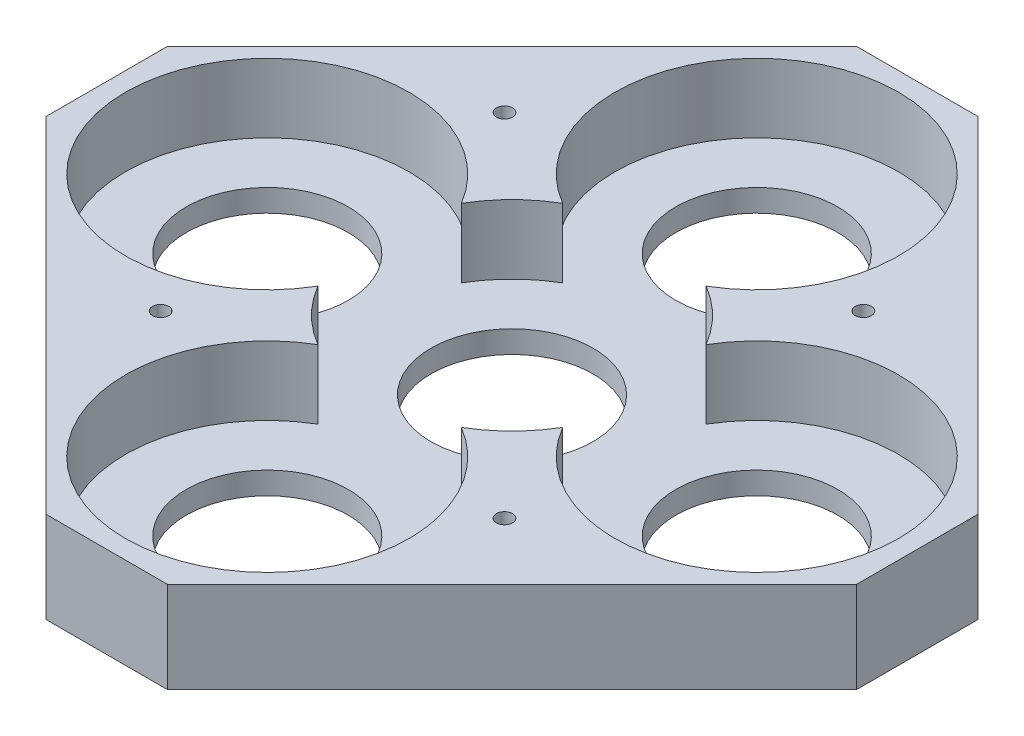
ISO-10303-21;
HEADER;
FILE_DESCRIPTION(('STEP AP214'),'2;1');
FILE_NAME('part.step','',(''),(''),'','','');
FILE_SCHEMA(('AUTOMOTIVE_DESIGN { 1 0 10303 214 1 1 1 1 }'));
ENDSEC;
DATA;
#1=APPLICATION_CONTEXT('core data for automotive mechanical design processes');
#2=APPLICATION_PROTOCOL_DEFINITION('international standard','automotive_design',2000,#1);
#3=PRODUCT_CONTEXT('',#1,'mechanical');
#4=PRODUCT('Part','Part','',(#3));
#5=PRODUCT_RELATED_PRODUCT_CATEGORY('part','',(#4));
#6=PRODUCT_DEFINITION_FORMATION('','',#4);
#7=PRODUCT_DEFINITION_CONTEXT('part definition',#1,'design');
#8=PRODUCT_DEFINITION('design','',#6,#7);
#9=PRODUCT_DEFINITION_SHAPE('','',#8);
#10=(LENGTH_UNIT() NAMED_UNIT(*) SI_UNIT(.MILLI.,.METRE.));
#11=(NAMED_UNIT(*) PLANE_ANGLE_UNIT() SI_UNIT($,.RADIAN.));
#12=(NAMED_UNIT(*) SI_UNIT($,.STERADIAN.) SOLID_ANGLE_UNIT());
#13=UNCERTAINTY_MEASURE_WITH_UNIT(LENGTH_MEASURE(1.E-05),#10,'distance_accuracy_value','');
#14=(GEOMETRIC_REPRESENTATION_CONTEXT(3) GLOBAL_UNCERTAINTY_ASSIGNED_CONTEXT((#13)) GLOBAL_UNIT_ASSIGNED_CONTEXT((#10,
#11,#12)) REPRESENTATION_CONTEXT('',''));
#15=CARTESIAN_POINT('',(0.,0.,0.));
#16=DIRECTION('',(0.,0.,1.));
#17=DIRECTION('',(1.,0.,0.));
#18=AXIS2_PLACEMENT_3D('',#15,#16,#17);
#19=CARTESIAN_POINT('',(273.05,0.,-127.));
#20=DIRECTION('',(0.707106781186548,0.,-0.707106781186548));
#21=DIRECTION('',(-0.707106781186548,0.,-0.707106781186547));
#22=AXIS2_PLACEMENT_3D('',#19,#20,#21);
#23=PLANE('',#22);
#24=DIRECTION('',(-0.707106781186548,0.,-0.707106781186547));
#25=VECTOR('',#24,1.);
#26=CARTESIAN_POINT('',(273.05,0.,-127.));
#27=LINE('',#26,#25);
#28=CARTESIAN_POINT('',(254.,0.,-146.05));
#29=VERTEX_POINT('',#28);
#30=CARTESIAN_POINT('',(146.05,0.,-254.));
#31=VERTEX_POINT('',#30);
#32=EDGE_CURVE('E228',#29,#31,#27,.T.);
#33=ORIENTED_EDGE('',*,*,#32,.T.);
#34=DIRECTION('',(0.,1.,0.));
#35=VECTOR('',#34,1.);
#36=CARTESIAN_POINT('',(146.05,0.,-254.));
#37=LINE('',#36,#35);
#38=CARTESIAN_POINT('',(146.05,28.575,-254.));
#39=VERTEX_POINT('',#38);
#40=EDGE_CURVE('E252',#31,#39,#37,.T.);
#41=ORIENTED_EDGE('',*,*,#40,.T.);
#42=DIRECTION('',(-0.707106781186548,0.,-0.707106781186547));
#43=VECTOR('',#42,1.);
#44=CARTESIAN_POINT('',(273.05,28.575,-127.));
#45=LINE('',#44,#43);
#46=CARTESIAN_POINT('',(254.,28.575,-146.05));
#47=VERTEX_POINT('',#46);
#48=EDGE_CURVE('E216',#47,#39,#45,.T.);
#49=ORIENTED_EDGE('',*,*,#48,.F.);
#50=DIRECTION('',(0.,-1.,0.));
#51=VECTOR('',#50,1.);
#52=CARTESIAN_POINT('',(254.,0.,-146.05));
#53=LINE('',#52,#51);
#54=EDGE_CURVE('E240',#47,#29,#53,.T.);
#55=ORIENTED_EDGE('',*,*,#54,.T.);
#56=EDGE_LOOP('',(#33,#41,#49,#55));
#57=FACE_BOUND('',#56,.T.);
#58=ADVANCED_FACE('F37',(#57),#23,.T.);
#59=CARTESIAN_POINT('',(127.,0.,19.05));
#60=DIRECTION('',(0.707106781186547,0.,0.707106781186547));
#61=DIRECTION('',(0.707106781186548,0.,-0.707106781186548));
#62=AXIS2_PLACEMENT_3D('',#59,#60,#61);
#63=PLANE('',#62);
#64=DIRECTION('',(0.707106781186548,0.,-0.707106781186548));
#65=VECTOR('',#64,1.);
#66=CARTESIAN_POINT('',(127.,0.,19.05));
#67=LINE('',#66,#65);
#68=CARTESIAN_POINT('',(146.05,0.,-1.76941794549634E-13));
#69=VERTEX_POINT('',#68);
#70=CARTESIAN_POINT('',(254.,0.,-107.95));
#71=VERTEX_POINT('',#70);
#72=EDGE_CURVE('E237',#69,#71,#67,.T.);
#73=ORIENTED_EDGE('',*,*,#72,.T.);
#74=DIRECTION('',(0.,1.,0.));
#75=VECTOR('',#74,1.);
#76=CARTESIAN_POINT('',(254.,0.,-107.95));
#77=LINE('',#76,#75);
#78=CARTESIAN_POINT('',(254.,28.575,-107.95));
#79=VERTEX_POINT('',#78);
#80=EDGE_CURVE('E277',#71,#79,#77,.T.);
#81=ORIENTED_EDGE('',*,*,#80,.T.);
#82=DIRECTION('',(0.707106781186548,0.,-0.707106781186548));
#83=VECTOR('',#82,1.);
#84=CARTESIAN_POINT('',(127.,28.575,19.05));
#85=LINE('',#84,#83);
#86=CARTESIAN_POINT('',(146.05,28.575,-1.76941794549634E-13));
#87=VERTEX_POINT('',#86);
#88=EDGE_CURVE('E232',#87,#79,#85,.T.);
#89=ORIENTED_EDGE('',*,*,#88,.F.);
#90=DIRECTION('',(0.,-1.,0.));
#91=VECTOR('',#90,1.);
#92=CARTESIAN_POINT('',(146.05,0.,-1.73472347597681E-13));
#93=LINE('',#92,#91);
#94=EDGE_CURVE('E275',#87,#69,#93,.T.);
#95=ORIENTED_EDGE('',*,*,#94,.T.);
#96=EDGE_LOOP('',(#73,#81,#89,#95));
#97=FACE_BOUND('',#96,.T.);
#98=ADVANCED_FACE('F309',(#97),#63,.T.);
#99=CARTESIAN_POINT('',(-19.05,0.,-127.));
#100=DIRECTION('',(-0.707106781186547,0.,0.707106781186547));
#101=DIRECTION('',(0.707106781186548,0.,0.707106781186548));
#102=AXIS2_PLACEMENT_3D('',#99,#100,#101);
#103=PLANE('',#102);
#104=DIRECTION('',(0.707106781186548,0.,0.707106781186548));
#105=VECTOR('',#104,1.);
#106=CARTESIAN_POINT('',(-19.05,28.575,-127.));
#107=LINE('',#106,#105);
#108=CARTESIAN_POINT('',(1.6306400674182E-13,28.575,-107.95));
#109=VERTEX_POINT('',#108);
#110=CARTESIAN_POINT('',(107.95,28.575,0.));
#111=VERTEX_POINT('',#110);
#112=EDGE_CURVE('E246',#109,#111,#107,.T.);
#113=ORIENTED_EDGE('',*,*,#112,.F.);
#114=DIRECTION('',(0.,-1.,0.));
#115=VECTOR('',#114,1.);
#116=CARTESIAN_POINT('',(1.59594559789866E-13,0.,-107.95));
#117=LINE('',#116,#115);
#118=CARTESIAN_POINT('',(1.6306400674182E-13,0.,-107.95));
#119=VERTEX_POINT('',#118);
#120=EDGE_CURVE('E11',#109,#119,#117,.T.);
#121=ORIENTED_EDGE('',*,*,#120,.T.);
#122=DIRECTION('',(0.707106781186548,0.,0.707106781186548));
#123=VECTOR('',#122,1.);
#124=CARTESIAN_POINT('',(-19.05,0.,-127.));
#125=LINE('',#124,#123);
#126=CARTESIAN_POINT('',(107.95,0.,0.));
#127=VERTEX_POINT('',#126);
#128=EDGE_CURVE('E235',#119,#127,#125,.T.);
#129=ORIENTED_EDGE('',*,*,#128,.T.);
#130=DIRECTION('',(0.,1.,0.));
#131=VECTOR('',#130,1.);
#132=CARTESIAN_POINT('',(107.95,0.,0.));
#133=LINE('',#132,#131);
#134=EDGE_CURVE('E45',#127,#111,#133,.T.);
#135=ORIENTED_EDGE('',*,*,#134,.T.);
#136=EDGE_LOOP('',(#113,#121,#129,#135));
#137=FACE_BOUND('',#136,.T.);
#138=ADVANCED_FACE('F281',(#137),#103,.T.);
#139=CARTESIAN_POINT('',(127.,0.,-273.05));
#140=DIRECTION('',(-0.707106781186548,0.,-0.707106781186548));
#141=DIRECTION('',(-0.707106781186547,0.,0.707106781186548));
#142=AXIS2_PLACEMENT_3D('',#139,#140,#141);
#143=PLANE('',#142);
#144=DIRECTION('',(-0.707106781186547,0.,0.707106781186548));
#145=VECTOR('',#144,1.);
#146=CARTESIAN_POINT('',(127.,28.575,-273.05));
#147=LINE('',#146,#145);
#148=CARTESIAN_POINT('',(107.95,28.575,-254.));
#149=VERTEX_POINT('',#148);
#150=CARTESIAN_POINT('',(0.,28.575,-146.05));
#151=VERTEX_POINT('',#150);
#152=EDGE_CURVE('E243',#149,#151,#147,.T.);
#153=ORIENTED_EDGE('',*,*,#152,.F.);
#154=DIRECTION('',(0.,-1.,0.));
#155=VECTOR('',#154,1.);
#156=CARTESIAN_POINT('',(107.95,0.,-254.));
#157=LINE('',#156,#155);
#158=CARTESIAN_POINT('',(107.95,0.,-254.));
#159=VERTEX_POINT('',#158);
#160=EDGE_CURVE('E266',#149,#159,#157,.T.);
#161=ORIENTED_EDGE('',*,*,#160,.T.);
#162=DIRECTION('',(-0.707106781186547,0.,0.707106781186548));
#163=VECTOR('',#162,1.);
#164=CARTESIAN_POINT('',(127.,0.,-273.05));
#165=LINE('',#164,#163);
#166=CARTESIAN_POINT('',(0.,0.,-146.05));
#167=VERTEX_POINT('',#166);
#168=EDGE_CURVE('E231',#159,#167,#165,.T.);
#169=ORIENTED_EDGE('',*,*,#168,.T.);
#170=DIRECTION('',(0.,1.,0.));
#171=VECTOR('',#170,1.);
#172=CARTESIAN_POINT('',(0.,0.,-146.05));
#173=LINE('',#172,#171);
#174=EDGE_CURVE('E263',#167,#151,#173,.T.);
#175=ORIENTED_EDGE('',*,*,#174,.T.);
#176=EDGE_LOOP('',(#153,#161,#169,#175));
#177=FACE_BOUND('',#176,.T.);
#178=ADVANCED_FACE('F292',(#177),#143,.T.);
#179=CARTESIAN_POINT('',(0.,0.,0.));
#180=DIRECTION('',(0.,1.,0.));
#181=DIRECTION('',(0.,0.,1.));
#182=AXIS2_PLACEMENT_3D('',#179,#180,#181);
#183=PLANE('',#182);
#184=CARTESIAN_POINT('',(127.,0.,-127.));
#185=DIRECTION('',(0.,1.,0.));
#186=DIRECTION('',(0.,0.,1.));
#187=AXIS2_PLACEMENT_3D('',#184,#185,#186);
#188=CIRCLE('',#187,25.4);
#189=CARTESIAN_POINT('',(127.,0.,-101.6));
#190=VERTEX_POINT('',#189);
#191=EDGE_CURVE('E569',#190,#190,#188,.T.);
#192=ORIENTED_EDGE('',*,*,#191,.T.);
#193=EDGE_LOOP('',(#192));
#194=FACE_BOUND('',#193,.T.);
#195=CARTESIAN_POINT('',(127.,0.,-203.708));
#196=DIRECTION('',(0.,1.,0.));
#197=DIRECTION('',(0.,0.,1.));
#198=AXIS2_PLACEMENT_3D('',#195,#196,#197);
#199=CIRCLE('',#198,25.4);
#200=CARTESIAN_POINT('',(127.,0.,-178.308));
#201=VERTEX_POINT('',#200);
#202=EDGE_CURVE('E573',#201,#201,#199,.T.);
#203=ORIENTED_EDGE('',*,*,#202,.T.);
#204=EDGE_LOOP('',(#203));
#205=FACE_BOUND('',#204,.T.);
#206=CARTESIAN_POINT('',(50.292,0.,-127.));
#207=DIRECTION('',(0.,1.,0.));
#208=DIRECTION('',(0.,0.,1.));
#209=AXIS2_PLACEMENT_3D('',#206,#207,#208);
#210=CIRCLE('',#209,25.4);
#211=CARTESIAN_POINT('',(50.292,0.,-101.6));
#212=VERTEX_POINT('',#211);
#213=EDGE_CURVE('E577',#212,#212,#210,.T.);
#214=ORIENTED_EDGE('',*,*,#213,.T.);
#215=EDGE_LOOP('',(#214));
#216=FACE_BOUND('',#215,.T.);
#217=CARTESIAN_POINT('',(127.,0.,-50.292));
#218=DIRECTION('',(0.,1.,0.));
#219=DIRECTION('',(0.,0.,1.));
#220=AXIS2_PLACEMENT_3D('',#217,#218,#219);
#221=CIRCLE('',#220,25.4);
#222=CARTESIAN_POINT('',(127.,0.,-24.892));
#223=VERTEX_POINT('',#222);
#224=EDGE_CURVE('E581',#223,#223,#221,.T.);
#225=ORIENTED_EDGE('',*,*,#224,.T.);
#226=EDGE_LOOP('',(#225));
#227=FACE_BOUND('',#226,.T.);
#228=CARTESIAN_POINT('',(203.708,0.,-127.));
#229=DIRECTION('',(0.,1.,0.));
#230=DIRECTION('',(0.,0.,1.));
#231=AXIS2_PLACEMENT_3D('',#228,#229,#230);
#232=CIRCLE('',#231,25.4);
#233=CARTESIAN_POINT('',(203.708,0.,-101.6));
#234=VERTEX_POINT('',#233);
#235=EDGE_CURVE('E585',#234,#234,#232,.T.);
#236=ORIENTED_EDGE('',*,*,#235,.T.);
#237=EDGE_LOOP('',(#236));
#238=FACE_BOUND('',#237,.T.);
#239=CARTESIAN_POINT('',(180.881536726415,0.,-183.247438789308));
#240=DIRECTION('',(0.,1.,0.));
#241=DIRECTION('',(0.,0.,1.));
#242=AXIS2_PLACEMENT_3D('',#239,#240,#241);
#243=CIRCLE('',#242,2.52729999999995);
#244=CARTESIAN_POINT('',(180.881536726415,0.,-180.720138789309));
#245=VERTEX_POINT('',#244);
#246=EDGE_CURVE('E589',#245,#245,#243,.T.);
#247=ORIENTED_EDGE('',*,*,#246,.T.);
#248=EDGE_LOOP('',(#247));
#249=FACE_BOUND('',#248,.T.);
#250=CARTESIAN_POINT('',(180.881536726415,0.,-70.7525612106915));
#251=DIRECTION('',(0.,1.,0.));
#252=DIRECTION('',(0.,0.,1.));
#253=AXIS2_PLACEMENT_3D('',#250,#251,#252);
#254=CIRCLE('',#253,2.52729999999995);
#255=CARTESIAN_POINT('',(180.881536726415,0.,-68.2252612106915));
#256=VERTEX_POINT('',#255);
#257=EDGE_CURVE('E593',#256,#256,#254,.T.);
#258=ORIENTED_EDGE('',*,*,#257,.T.);
#259=EDGE_LOOP('',(#258));
#260=FACE_BOUND('',#259,.T.);
#261=CARTESIAN_POINT('',(70.7525612106915,0.,-73.1184632735851));
#262=DIRECTION('',(0.,1.,0.));
#263=DIRECTION('',(0.,0.,1.));
#264=AXIS2_PLACEMENT_3D('',#261,#262,#263);
#265=CIRCLE('',#264,2.52729999999997);
#266=CARTESIAN_POINT('',(70.7525612106915,0.,-70.5911632735851));
#267=VERTEX_POINT('',#266);
#268=EDGE_CURVE('E597',#267,#267,#265,.T.);
#269=ORIENTED_EDGE('',*,*,#268,.T.);
#270=EDGE_LOOP('',(#269));
#271=FACE_BOUND('',#270,.T.);
#272=CARTESIAN_POINT('',(70.7525612106915,0.,-180.881536726415));
#273=DIRECTION('',(0.,1.,0.));
#274=DIRECTION('',(0.,0.,1.));
#275=AXIS2_PLACEMENT_3D('',#272,#273,#274);
#276=CIRCLE('',#275,2.52729999999997);
#277=CARTESIAN_POINT('',(70.7525612106915,0.,-178.354236726415));
#278=VERTEX_POINT('',#277);
#279=EDGE_CURVE('E181',#278,#278,#276,.T.);
#280=ORIENTED_EDGE('',*,*,#279,.T.);
#281=EDGE_LOOP('',(#280));
#282=FACE_BOUND('',#281,.T.);
#283=ORIENTED_EDGE('',*,*,#168,.F.);
#284=DIRECTION('',(-1.,0.,0.));
#285=VECTOR('',#284,1.);
#286=CARTESIAN_POINT('',(146.05,0.,-254.));
#287=LINE('',#286,#285);
#288=EDGE_CURVE('E273',#159,#31,#287,.F.);
#289=ORIENTED_EDGE('',*,*,#288,.T.);
#290=ORIENTED_EDGE('',*,*,#32,.F.);
#291=DIRECTION('',(0.,0.,-1.));
#292=VECTOR('',#291,1.);
#293=CARTESIAN_POINT('',(254.,0.,-107.95));
#294=LINE('',#293,#292);
#295=EDGE_CURVE('E271',#29,#71,#294,.F.);
#296=ORIENTED_EDGE('',*,*,#295,.T.);
#297=ORIENTED_EDGE('',*,*,#72,.F.);
#298=DIRECTION('',(1.,0.,0.));
#299=VECTOR('',#298,1.);
#300=CARTESIAN_POINT('',(107.95,0.,0.));
#301=LINE('',#300,#299);
#302=EDGE_CURVE('E52',#69,#127,#301,.F.);
#303=ORIENTED_EDGE('',*,*,#302,.T.);
#304=ORIENTED_EDGE('',*,*,#128,.F.);
#305=DIRECTION('',(0.,0.,1.));
#306=VECTOR('',#305,1.);
#307=CARTESIAN_POINT('',(0.,0.,-146.05));
#308=LINE('',#307,#306);
#309=EDGE_CURVE('E269',#119,#167,#308,.F.);
#310=ORIENTED_EDGE('',*,*,#309,.T.);
#311=EDGE_LOOP('',(#283,#289,#290,#296,#297,#303,#304,#310));
#312=FACE_BOUND('',#311,.T.);
#313=ADVANCED_FACE('F296',(#194,#205,#216,#227,#238,#249,#260,#271,#282,#312),#183,.F.);
#314=CARTESIAN_POINT('',(0.,28.575,0.));
#315=DIRECTION('',(0.,1.,0.));
#316=DIRECTION('',(0.,0.,1.));
#317=AXIS2_PLACEMENT_3D('',#314,#315,#316);
#318=PLANE('',#317);
#319=CARTESIAN_POINT('',(180.881536726415,28.575,-183.247438789308));
#320=DIRECTION('',(0.,1.,0.));
#321=DIRECTION('',(0.,0.,1.));
#322=AXIS2_PLACEMENT_3D('',#319,#320,#321);
#323=CIRCLE('',#322,2.52729999999998);
#324=CARTESIAN_POINT('',(180.881536726415,28.575,-180.720138789309));
#325=VERTEX_POINT('',#324);
#326=EDGE_CURVE('E614',#325,#325,#323,.T.);
#327=ORIENTED_EDGE('',*,*,#326,.F.);
#328=EDGE_LOOP('',(#327));
#329=FACE_BOUND('',#328,.T.);
#330=CARTESIAN_POINT('',(180.881536726415,28.575,-70.7525612106915));
#331=DIRECTION('',(0.,1.,0.));
#332=DIRECTION('',(0.,0.,1.));
#333=AXIS2_PLACEMENT_3D('',#330,#331,#332);
#334=CIRCLE('',#333,2.52729999999998);
#335=CARTESIAN_POINT('',(180.881536726415,28.575,-68.2252612106915));
#336=VERTEX_POINT('',#335);
#337=EDGE_CURVE('E610',#336,#336,#334,.T.);
#338=ORIENTED_EDGE('',*,*,#337,.F.);
#339=EDGE_LOOP('',(#338));
#340=FACE_BOUND('',#339,.T.);
#341=CARTESIAN_POINT('',(70.7525612106915,28.575,-73.1184632735851));
#342=DIRECTION('',(0.,1.,0.));
#343=DIRECTION('',(0.,0.,1.));
#344=AXIS2_PLACEMENT_3D('',#341,#342,#343);
#345=CIRCLE('',#344,2.52729999999997);
#346=CARTESIAN_POINT('',(70.7525612106915,28.575,-70.5911632735851));
#347=VERTEX_POINT('',#346);
#348=EDGE_CURVE('E604',#347,#347,#345,.T.);
#349=ORIENTED_EDGE('',*,*,#348,.F.);
#350=EDGE_LOOP('',(#349));
#351=FACE_BOUND('',#350,.T.);
#352=CARTESIAN_POINT('',(70.7525612106915,28.575,-180.881536726415));
#353=DIRECTION('',(0.,1.,0.));
#354=DIRECTION('',(0.,0.,1.));
#355=AXIS2_PLACEMENT_3D('',#352,#353,#354);
#356=CIRCLE('',#355,2.52729999999997);
#357=CARTESIAN_POINT('',(70.7525612106915,28.575,-178.354236726415));
#358=VERTEX_POINT('',#357);
#359=EDGE_CURVE('E600',#358,#358,#356,.T.);
#360=ORIENTED_EDGE('',*,*,#359,.F.);
#361=EDGE_LOOP('',(#360));
#362=FACE_BOUND('',#361,.T.);
#363=CARTESIAN_POINT('',(127.,28.575,-50.292));
#364=DIRECTION('',(0.,1.,0.));
#365=DIRECTION('',(0.,0.,1.));
#366=AXIS2_PLACEMENT_3D('',#363,#364,#365);
#367=CIRCLE('',#366,44.45);
#368=CARTESIAN_POINT('',(104.532842102304,28.575,-88.646));
#369=VERTEX_POINT('',#368);
#370=CARTESIAN_POINT('',(149.467157897696,28.575,-88.646));
#371=VERTEX_POINT('',#370);
#372=EDGE_CURVE('E157',#369,#371,#367,.T.);
#373=ORIENTED_EDGE('',*,*,#372,.F.);
#374=CARTESIAN_POINT('',(127.,28.575,-127.));
#375=DIRECTION('',(0.,1.,0.));
#376=DIRECTION('',(0.,0.,1.));
#377=AXIS2_PLACEMENT_3D('',#374,#375,#376);
#378=CIRCLE('',#377,44.45);
#379=CARTESIAN_POINT('',(88.646,28.575,-104.532842102304));
#380=VERTEX_POINT('',#379);
#381=EDGE_CURVE('E175',#380,#369,#378,.T.);
#382=ORIENTED_EDGE('',*,*,#381,.F.);
#383=CARTESIAN_POINT('',(50.292,28.575,-127.));
#384=DIRECTION('',(0.,1.,0.));
#385=DIRECTION('',(0.,0.,1.));
#386=AXIS2_PLACEMENT_3D('',#383,#384,#385);
#387=CIRCLE('',#386,44.45);
#388=CARTESIAN_POINT('',(88.646,28.575,-149.467157897696));
#389=VERTEX_POINT('',#388);
#390=EDGE_CURVE('E178',#389,#380,#387,.T.);
#391=ORIENTED_EDGE('',*,*,#390,.F.);
#392=CARTESIAN_POINT('',(127.,28.575,-127.));
#393=DIRECTION('',(0.,1.,0.));
#394=DIRECTION('',(0.,0.,1.));
#395=AXIS2_PLACEMENT_3D('',#392,#393,#394);
#396=CIRCLE('',#395,44.45);
#397=CARTESIAN_POINT('',(104.532842102304,28.575,-165.354));
#398=VERTEX_POINT('',#397);
#399=EDGE_CURVE('E209',#398,#389,#396,.T.);
#400=ORIENTED_EDGE('',*,*,#399,.F.);
#401=CARTESIAN_POINT('',(127.,28.575,-203.708));
#402=DIRECTION('',(0.,1.,0.));
#403=DIRECTION('',(0.,0.,1.));
#404=AXIS2_PLACEMENT_3D('',#401,#402,#403);
#405=CIRCLE('',#404,44.45);
#406=CARTESIAN_POINT('',(149.467157897696,28.575,-165.354));
#407=VERTEX_POINT('',#406);
#408=EDGE_CURVE('E206',#407,#398,#405,.T.);
#409=ORIENTED_EDGE('',*,*,#408,.F.);
#410=CARTESIAN_POINT('',(127.,28.575,-127.));
#411=DIRECTION('',(0.,1.,0.));
#412=DIRECTION('',(0.,0.,1.));
#413=AXIS2_PLACEMENT_3D('',#410,#411,#412);
#414=CIRCLE('',#413,44.45);
#415=CARTESIAN_POINT('',(165.354,28.575,-149.467157897696));
#416=VERTEX_POINT('',#415);
#417=EDGE_CURVE('E203',#416,#407,#414,.T.);
#418=ORIENTED_EDGE('',*,*,#417,.F.);
#419=CARTESIAN_POINT('',(203.708,28.575,-127.));
#420=DIRECTION('',(0.,1.,0.));
#421=DIRECTION('',(0.,0.,1.));
#422=AXIS2_PLACEMENT_3D('',#419,#420,#421);
#423=CIRCLE('',#422,44.45);
#424=CARTESIAN_POINT('',(165.354,28.575,-104.532842102304));
#425=VERTEX_POINT('',#424);
#426=EDGE_CURVE('E200',#425,#416,#423,.T.);
#427=ORIENTED_EDGE('',*,*,#426,.F.);
#428=CARTESIAN_POINT('',(127.,28.575,-127.));
#429=DIRECTION('',(0.,1.,0.));
#430=DIRECTION('',(0.,0.,1.));
#431=AXIS2_PLACEMENT_3D('',#428,#429,#430);
#432=CIRCLE('',#431,44.45);
#433=EDGE_CURVE('E198',#371,#425,#432,.T.);
#434=ORIENTED_EDGE('',*,*,#433,.F.);
#435=EDGE_LOOP('',(#373,#382,#391,#400,#409,#418,#427,#434));
#436=FACE_BOUND('',#435,.T.);
#437=ORIENTED_EDGE('',*,*,#48,.T.);
#438=DIRECTION('',(1.,0.,0.));
#439=VECTOR('',#438,1.);
#440=CARTESIAN_POINT('',(-7.40148683083433E-13,28.575,-254.));
#441=LINE('',#440,#439);
#442=EDGE_CURVE('E261',#39,#149,#441,.F.);
#443=ORIENTED_EDGE('',*,*,#442,.T.);
#444=ORIENTED_EDGE('',*,*,#152,.T.);
#445=DIRECTION('',(0.,0.,-1.));
#446=VECTOR('',#445,1.);
#447=CARTESIAN_POINT('',(0.,28.575,0.));
#448=LINE('',#447,#446);
#449=EDGE_CURVE('E257',#151,#109,#448,.F.);
#450=ORIENTED_EDGE('',*,*,#449,.T.);
#451=ORIENTED_EDGE('',*,*,#112,.T.);
#452=DIRECTION('',(-1.,0.,0.));
#453=VECTOR('',#452,1.);
#454=CARTESIAN_POINT('',(0.,28.575,0.));
#455=LINE('',#454,#453);
#456=EDGE_CURVE('E255',#111,#87,#455,.F.);
#457=ORIENTED_EDGE('',*,*,#456,.T.);
#458=ORIENTED_EDGE('',*,*,#88,.T.);
#459=DIRECTION('',(0.,0.,1.));
#460=VECTOR('',#459,1.);
#461=CARTESIAN_POINT('',(254.,28.575,-7.40148683083439E-13));
#462=LINE('',#461,#460);
#463=EDGE_CURVE('E259',#79,#47,#462,.F.);
#464=ORIENTED_EDGE('',*,*,#463,.T.);
#465=EDGE_LOOP('',(#437,#443,#444,#450,#451,#457,#458,#464));
#466=FACE_BOUND('',#465,.T.);
#467=ADVANCED_FACE('F284',(#329,#340,#351,#362,#436,#466),#318,.T.);
#468=CARTESIAN_POINT('',(127.,6.985,-50.292));
#469=DIRECTION('',(0.,1.,0.));
#470=DIRECTION('',(0.,0.,1.));
#471=AXIS2_PLACEMENT_3D('',#468,#469,#470);
#472=CYLINDRICAL_SURFACE('',#471,44.45);
#473=ORIENTED_EDGE('',*,*,#372,.T.);
#474=DIRECTION('',(0.,1.,0.));
#475=VECTOR('',#474,1.);
#476=CARTESIAN_POINT('',(149.467157897696,6.985,-88.646));
#477=LINE('',#476,#475);
#478=CARTESIAN_POINT('',(149.467157897696,6.985,-88.646));
#479=VERTEX_POINT('',#478);
#480=EDGE_CURVE('E150',#479,#371,#477,.T.);
#481=ORIENTED_EDGE('',*,*,#480,.F.);
#482=CARTESIAN_POINT('',(127.,6.985,-50.292));
#483=DIRECTION('',(0.,1.,0.));
#484=DIRECTION('',(0.,0.,1.));
#485=AXIS2_PLACEMENT_3D('',#482,#483,#484);
#486=CIRCLE('',#485,44.45);
#487=CARTESIAN_POINT('',(104.532842102304,6.985,-88.646));
#488=VERTEX_POINT('',#487);
#489=EDGE_CURVE('E154',#488,#479,#486,.T.);
#490=ORIENTED_EDGE('',*,*,#489,.F.);
#491=DIRECTION('',(0.,1.,0.));
#492=VECTOR('',#491,1.);
#493=CARTESIAN_POINT('',(104.532842102304,6.985,-88.646));
#494=LINE('',#493,#492);
#495=EDGE_CURVE('E214',#488,#369,#494,.T.);
#496=ORIENTED_EDGE('',*,*,#495,.T.);
#497=EDGE_LOOP('',(#473,#481,#490,#496));
#498=FACE_BOUND('',#497,.T.);
#499=ADVANCED_FACE('F152',(#498),#472,.F.);
#500=CARTESIAN_POINT('',(127.,6.985,-127.));
#501=DIRECTION('',(0.,1.,0.));
#502=DIRECTION('',(0.,0.,1.));
#503=AXIS2_PLACEMENT_3D('',#500,#501,#502);
#504=CYLINDRICAL_SURFACE('',#503,44.45);
#505=ORIENTED_EDGE('',*,*,#381,.T.);
#506=ORIENTED_EDGE('',*,*,#495,.F.);
#507=CARTESIAN_POINT('',(127.,6.985,-127.));
#508=DIRECTION('',(0.,1.,0.));
#509=DIRECTION('',(0.,0.,1.));
#510=AXIS2_PLACEMENT_3D('',#507,#508,#509);
#511=CIRCLE('',#510,44.45);
#512=CARTESIAN_POINT('',(88.646,6.985,-104.532842102304));
#513=VERTEX_POINT('',#512);
#514=EDGE_CURVE('E162',#513,#488,#511,.T.);
#515=ORIENTED_EDGE('',*,*,#514,.F.);
#516=DIRECTION('',(0.,1.,0.));
#517=VECTOR('',#516,1.);
#518=CARTESIAN_POINT('',(88.646,6.985,-104.532842102304));
#519=LINE('',#518,#517);
#520=EDGE_CURVE('E217',#513,#380,#519,.T.);
#521=ORIENTED_EDGE('',*,*,#520,.T.);
#522=EDGE_LOOP('',(#505,#506,#515,#521));
#523=FACE_BOUND('',#522,.T.);
#524=ADVANCED_FACE('F489',(#523),#504,.F.);
#525=CARTESIAN_POINT('',(50.292,6.985,-127.));
#526=DIRECTION('',(0.,1.,0.));
#527=DIRECTION('',(0.,0.,1.));
#528=AXIS2_PLACEMENT_3D('',#525,#526,#527);
#529=CYLINDRICAL_SURFACE('',#528,44.45);
#530=ORIENTED_EDGE('',*,*,#390,.T.);
#531=ORIENTED_EDGE('',*,*,#520,.F.);
#532=CARTESIAN_POINT('',(50.292,6.985,-127.));
#533=DIRECTION('',(0.,1.,0.));
#534=DIRECTION('',(0.,0.,1.));
#535=AXIS2_PLACEMENT_3D('',#532,#533,#534);
#536=CIRCLE('',#535,44.45);
#537=CARTESIAN_POINT('',(88.646,6.985,-149.467157897696));
#538=VERTEX_POINT('',#537);
#539=EDGE_CURVE('E194',#538,#513,#536,.T.);
#540=ORIENTED_EDGE('',*,*,#539,.F.);
#541=DIRECTION('',(0.,1.,0.));
#542=VECTOR('',#541,1.);
#543=CARTESIAN_POINT('',(88.646,6.985,-149.467157897696));
#544=LINE('',#543,#542);
#545=EDGE_CURVE('E219',#538,#389,#544,.T.);
#546=ORIENTED_EDGE('',*,*,#545,.T.);
#547=EDGE_LOOP('',(#530,#531,#540,#546));
#548=FACE_BOUND('',#547,.T.);
#549=ADVANCED_FACE('F480',(#548),#529,.F.);
#550=CARTESIAN_POINT('',(127.,6.985,-127.));
#551=DIRECTION('',(0.,1.,0.));
#552=DIRECTION('',(0.,0.,1.));
#553=AXIS2_PLACEMENT_3D('',#550,#551,#552);
#554=CYLINDRICAL_SURFACE('',#553,44.45);
#555=ORIENTED_EDGE('',*,*,#399,.T.);
#556=ORIENTED_EDGE('',*,*,#545,.F.);
#557=CARTESIAN_POINT('',(127.,6.985,-127.));
#558=DIRECTION('',(0.,1.,0.));
#559=DIRECTION('',(0.,0.,1.));
#560=AXIS2_PLACEMENT_3D('',#557,#558,#559);
#561=CIRCLE('',#560,44.45);
#562=CARTESIAN_POINT('',(104.532842102304,6.985,-165.354));
#563=VERTEX_POINT('',#562);
#564=EDGE_CURVE('E191',#563,#538,#561,.T.);
#565=ORIENTED_EDGE('',*,*,#564,.F.);
#566=DIRECTION('',(0.,1.,0.));
#567=VECTOR('',#566,1.);
#568=CARTESIAN_POINT('',(104.532842102304,6.985,-165.354));
#569=LINE('',#568,#567);
#570=EDGE_CURVE('E221',#563,#398,#569,.T.);
#571=ORIENTED_EDGE('',*,*,#570,.T.);
#572=EDGE_LOOP('',(#555,#556,#565,#571));
#573=FACE_BOUND('',#572,.T.);
#574=ADVANCED_FACE('F471',(#573),#554,.F.);
#575=CARTESIAN_POINT('',(127.,6.985,-203.708));
#576=DIRECTION('',(0.,1.,0.));
#577=DIRECTION('',(0.,0.,1.));
#578=AXIS2_PLACEMENT_3D('',#575,#576,#577);
#579=CYLINDRICAL_SURFACE('',#578,44.45);
#580=ORIENTED_EDGE('',*,*,#408,.T.);
#581=ORIENTED_EDGE('',*,*,#570,.F.);
#582=CARTESIAN_POINT('',(127.,6.985,-203.708));
#583=DIRECTION('',(0.,1.,0.));
#584=DIRECTION('',(0.,0.,1.));
#585=AXIS2_PLACEMENT_3D('',#582,#583,#584);
#586=CIRCLE('',#585,44.45);
#587=CARTESIAN_POINT('',(149.467157897696,6.985,-165.354));
#588=VERTEX_POINT('',#587);
#589=EDGE_CURVE('E188',#588,#563,#586,.T.);
#590=ORIENTED_EDGE('',*,*,#589,.F.);
#591=DIRECTION('',(0.,1.,0.));
#592=VECTOR('',#591,1.);
#593=CARTESIAN_POINT('',(149.467157897696,6.985,-165.354));
#594=LINE('',#593,#592);
#595=EDGE_CURVE('E223',#588,#407,#594,.T.);
#596=ORIENTED_EDGE('',*,*,#595,.T.);
#597=EDGE_LOOP('',(#580,#581,#590,#596));
#598=FACE_BOUND('',#597,.T.);
#599=ADVANCED_FACE('F462',(#598),#579,.F.);
#600=CARTESIAN_POINT('',(127.,6.985,-127.));
#601=DIRECTION('',(0.,1.,0.));
#602=DIRECTION('',(0.,0.,1.));
#603=AXIS2_PLACEMENT_3D('',#600,#601,#602);
#604=CYLINDRICAL_SURFACE('',#603,44.45);
#605=ORIENTED_EDGE('',*,*,#417,.T.);
#606=ORIENTED_EDGE('',*,*,#595,.F.);
#607=CARTESIAN_POINT('',(127.,6.985,-127.));
#608=DIRECTION('',(0.,1.,0.));
#609=DIRECTION('',(0.,0.,1.));
#610=AXIS2_PLACEMENT_3D('',#607,#608,#609);
#611=CIRCLE('',#610,44.45);
#612=CARTESIAN_POINT('',(165.354,6.985,-149.467157897696));
#613=VERTEX_POINT('',#612);
#614=EDGE_CURVE('E185',#613,#588,#611,.T.);
#615=ORIENTED_EDGE('',*,*,#614,.F.);
#616=DIRECTION('',(0.,1.,0.));
#617=VECTOR('',#616,1.);
#618=CARTESIAN_POINT('',(165.354,6.985,-149.467157897696));
#619=LINE('',#618,#617);
#620=EDGE_CURVE('E225',#613,#416,#619,.T.);
#621=ORIENTED_EDGE('',*,*,#620,.T.);
#622=EDGE_LOOP('',(#605,#606,#615,#621));
#623=FACE_BOUND('',#622,.T.);
#624=ADVANCED_FACE('F453',(#623),#604,.F.);
#625=CARTESIAN_POINT('',(203.708,6.985,-127.));
#626=DIRECTION('',(0.,1.,0.));
#627=DIRECTION('',(0.,0.,1.));
#628=AXIS2_PLACEMENT_3D('',#625,#626,#627);
#629=CYLINDRICAL_SURFACE('',#628,44.45);
#630=ORIENTED_EDGE('',*,*,#426,.T.);
#631=ORIENTED_EDGE('',*,*,#620,.F.);
#632=CARTESIAN_POINT('',(203.708,6.985,-127.));
#633=DIRECTION('',(0.,1.,0.));
#634=DIRECTION('',(0.,0.,1.));
#635=AXIS2_PLACEMENT_3D('',#632,#633,#634);
#636=CIRCLE('',#635,44.45);
#637=CARTESIAN_POINT('',(165.354,6.985,-104.532842102304));
#638=VERTEX_POINT('',#637);
#639=EDGE_CURVE('E170',#638,#613,#636,.T.);
#640=ORIENTED_EDGE('',*,*,#639,.F.);
#641=DIRECTION('',(0.,1.,0.));
#642=VECTOR('',#641,1.);
#643=CARTESIAN_POINT('',(165.354,6.985,-104.532842102304));
#644=LINE('',#643,#642);
#645=EDGE_CURVE('E161',#638,#425,#644,.T.);
#646=ORIENTED_EDGE('',*,*,#645,.T.);
#647=EDGE_LOOP('',(#630,#631,#640,#646));
#648=FACE_BOUND('',#647,.T.);
#649=ADVANCED_FACE('F445',(#648),#629,.F.);
#650=CARTESIAN_POINT('',(127.,6.985,-127.));
#651=DIRECTION('',(0.,1.,0.));
#652=DIRECTION('',(0.,0.,1.));
#653=AXIS2_PLACEMENT_3D('',#650,#651,#652);
#654=CYLINDRICAL_SURFACE('',#653,44.45);
#655=ORIENTED_EDGE('',*,*,#433,.T.);
#656=ORIENTED_EDGE('',*,*,#645,.F.);
#657=CARTESIAN_POINT('',(127.,6.985,-127.));
#658=DIRECTION('',(0.,1.,0.));
#659=DIRECTION('',(0.,0.,1.));
#660=AXIS2_PLACEMENT_3D('',#657,#658,#659);
#661=CIRCLE('',#660,44.45);
#662=EDGE_CURVE('E165',#479,#638,#661,.T.);
#663=ORIENTED_EDGE('',*,*,#662,.F.);
#664=ORIENTED_EDGE('',*,*,#480,.T.);
#665=EDGE_LOOP('',(#655,#656,#663,#664));
#666=FACE_BOUND('',#665,.T.);
#667=ADVANCED_FACE('F166',(#666),#654,.F.);
#668=CARTESIAN_POINT('',(127.,6.985,-88.646));
#669=DIRECTION('',(0.,1.,0.));
#670=DIRECTION('',(0.,0.,1.));
#671=AXIS2_PLACEMENT_3D('',#668,#669,#670);
#672=PLANE('',#671);
#673=CARTESIAN_POINT('',(127.,6.985,-127.));
#674=DIRECTION('',(0.,1.,0.));
#675=DIRECTION('',(0.,0.,1.));
#676=AXIS2_PLACEMENT_3D('',#673,#674,#675);
#677=CIRCLE('',#676,25.4);
#678=CARTESIAN_POINT('',(127.,6.985,-101.6));
#679=VERTEX_POINT('',#678);
#680=EDGE_CURVE('E634',#679,#679,#677,.T.);
#681=ORIENTED_EDGE('',*,*,#680,.F.);
#682=EDGE_LOOP('',(#681));
#683=FACE_BOUND('',#682,.T.);
#684=CARTESIAN_POINT('',(127.,6.985,-203.708));
#685=DIRECTION('',(0.,1.,0.));
#686=DIRECTION('',(0.,0.,1.));
#687=AXIS2_PLACEMENT_3D('',#684,#685,#686);
#688=CIRCLE('',#687,25.4);
#689=CARTESIAN_POINT('',(127.,6.985,-178.308));
#690=VERTEX_POINT('',#689);
#691=EDGE_CURVE('E630',#690,#690,#688,.T.);
#692=ORIENTED_EDGE('',*,*,#691,.F.);
#693=EDGE_LOOP('',(#692));
#694=FACE_BOUND('',#693,.T.);
#695=CARTESIAN_POINT('',(50.292,6.985,-127.));
#696=DIRECTION('',(0.,1.,0.));
#697=DIRECTION('',(0.,0.,1.));
#698=AXIS2_PLACEMENT_3D('',#695,#696,#697);
#699=CIRCLE('',#698,25.4);
#700=CARTESIAN_POINT('',(50.292,6.985,-101.6));
#701=VERTEX_POINT('',#700);
#702=EDGE_CURVE('E626',#701,#701,#699,.T.);
#703=ORIENTED_EDGE('',*,*,#702,.F.);
#704=EDGE_LOOP('',(#703));
#705=FACE_BOUND('',#704,.T.);
#706=CARTESIAN_POINT('',(127.,6.985,-50.292));
#707=DIRECTION('',(0.,1.,0.));
#708=DIRECTION('',(0.,0.,1.));
#709=AXIS2_PLACEMENT_3D('',#706,#707,#708);
#710=CIRCLE('',#709,25.4);
#711=CARTESIAN_POINT('',(127.,6.985,-24.892));
#712=VERTEX_POINT('',#711);
#713=EDGE_CURVE('E622',#712,#712,#710,.T.);
#714=ORIENTED_EDGE('',*,*,#713,.F.);
#715=EDGE_LOOP('',(#714));
#716=FACE_BOUND('',#715,.T.);
#717=CARTESIAN_POINT('',(203.708,6.985,-127.));
#718=DIRECTION('',(0.,1.,0.));
#719=DIRECTION('',(0.,0.,1.));
#720=AXIS2_PLACEMENT_3D('',#717,#718,#719);
#721=CIRCLE('',#720,25.4);
#722=CARTESIAN_POINT('',(203.708,6.985,-101.6));
#723=VERTEX_POINT('',#722);
#724=EDGE_CURVE('E618',#723,#723,#721,.T.);
#725=ORIENTED_EDGE('',*,*,#724,.F.);
#726=EDGE_LOOP('',(#725));
#727=FACE_BOUND('',#726,.T.);
#728=ORIENTED_EDGE('',*,*,#489,.T.);
#729=ORIENTED_EDGE('',*,*,#662,.T.);
#730=ORIENTED_EDGE('',*,*,#639,.T.);
#731=ORIENTED_EDGE('',*,*,#614,.T.);
#732=ORIENTED_EDGE('',*,*,#589,.T.);
#733=ORIENTED_EDGE('',*,*,#564,.T.);
#734=ORIENTED_EDGE('',*,*,#539,.T.);
#735=ORIENTED_EDGE('',*,*,#514,.T.);
#736=EDGE_LOOP('',(#728,#729,#730,#731,#732,#733,#734,#735));
#737=FACE_BOUND('',#736,.T.);
#738=ADVANCED_FACE('F172',(#683,#694,#705,#716,#727,#737),#672,.T.);
#739=CARTESIAN_POINT('',(70.7525612106915,28.575,-180.881536726415));
#740=DIRECTION('',(0.,1.,0.));
#741=DIRECTION('',(0.,0.,1.));
#742=AXIS2_PLACEMENT_3D('',#739,#740,#741);
#743=CYLINDRICAL_SURFACE('',#742,2.52729999999997);
#744=ORIENTED_EDGE('',*,*,#279,.F.);
#745=EDGE_LOOP('',(#744));
#746=FACE_BOUND('',#745,.T.);
#747=ORIENTED_EDGE('',*,*,#359,.T.);
#748=EDGE_LOOP('',(#747));
#749=FACE_BOUND('',#748,.T.);
#750=ADVANCED_FACE('F421',(#746,#749),#743,.F.);
#751=CARTESIAN_POINT('',(70.7525612106915,28.575,-73.1184632735851));
#752=DIRECTION('',(0.,1.,0.));
#753=DIRECTION('',(0.,0.,1.));
#754=AXIS2_PLACEMENT_3D('',#751,#752,#753);
#755=CYLINDRICAL_SURFACE('',#754,2.52729999999997);
#756=ORIENTED_EDGE('',*,*,#268,.F.);
#757=EDGE_LOOP('',(#756));
#758=FACE_BOUND('',#757,.T.);
#759=ORIENTED_EDGE('',*,*,#348,.T.);
#760=EDGE_LOOP('',(#759));
#761=FACE_BOUND('',#760,.T.);
#762=ADVANCED_FACE('F412',(#758,#761),#755,.F.);
#763=CARTESIAN_POINT('',(180.881536726415,28.575,-70.7525612106915));
#764=DIRECTION('',(0.,1.,0.));
#765=DIRECTION('',(0.,0.,1.));
#766=AXIS2_PLACEMENT_3D('',#763,#764,#765);
#767=CYLINDRICAL_SURFACE('',#766,2.52729999999997);
#768=ORIENTED_EDGE('',*,*,#257,.F.);
#769=EDGE_LOOP('',(#768));
#770=FACE_BOUND('',#769,.T.);
#771=ORIENTED_EDGE('',*,*,#337,.T.);
#772=EDGE_LOOP('',(#771));
#773=FACE_BOUND('',#772,.T.);
#774=ADVANCED_FACE('F403',(#770,#773),#767,.F.);
#775=CARTESIAN_POINT('',(180.881536726415,28.575,-183.247438789308));
#776=DIRECTION('',(0.,1.,0.));
#777=DIRECTION('',(0.,0.,1.));
#778=AXIS2_PLACEMENT_3D('',#775,#776,#777);
#779=CYLINDRICAL_SURFACE('',#778,2.52729999999997);
#780=ORIENTED_EDGE('',*,*,#246,.F.);
#781=EDGE_LOOP('',(#780));
#782=FACE_BOUND('',#781,.T.);
#783=ORIENTED_EDGE('',*,*,#326,.T.);
#784=EDGE_LOOP('',(#783));
#785=FACE_BOUND('',#784,.T.);
#786=ADVANCED_FACE('F393',(#782,#785),#779,.F.);
#787=CARTESIAN_POINT('',(203.708,6.985,-127.));
#788=DIRECTION('',(0.,1.,0.));
#789=DIRECTION('',(0.,0.,1.));
#790=AXIS2_PLACEMENT_3D('',#787,#788,#789);
#791=CYLINDRICAL_SURFACE('',#790,25.4);
#792=ORIENTED_EDGE('',*,*,#235,.F.);
#793=EDGE_LOOP('',(#792));
#794=FACE_BOUND('',#793,.T.);
#795=ORIENTED_EDGE('',*,*,#724,.T.);
#796=EDGE_LOOP('',(#795));
#797=FACE_BOUND('',#796,.T.);
#798=ADVANCED_FACE('F384',(#794,#797),#791,.F.);
#799=CARTESIAN_POINT('',(127.,6.985,-50.292));
#800=DIRECTION('',(0.,1.,0.));
#801=DIRECTION('',(0.,0.,1.));
#802=AXIS2_PLACEMENT_3D('',#799,#800,#801);
#803=CYLINDRICAL_SURFACE('',#802,25.4);
#804=ORIENTED_EDGE('',*,*,#224,.F.);
#805=EDGE_LOOP('',(#804));
#806=FACE_BOUND('',#805,.T.);
#807=ORIENTED_EDGE('',*,*,#713,.T.);
#808=EDGE_LOOP('',(#807));
#809=FACE_BOUND('',#808,.T.);
#810=ADVANCED_FACE('F375',(#806,#809),#803,.F.);
#811=CARTESIAN_POINT('',(50.292,6.985,-127.));
#812=DIRECTION('',(0.,1.,0.));
#813=DIRECTION('',(0.,0.,1.));
#814=AXIS2_PLACEMENT_3D('',#811,#812,#813);
#815=CYLINDRICAL_SURFACE('',#814,25.4);
#816=ORIENTED_EDGE('',*,*,#213,.F.);
#817=EDGE_LOOP('',(#816));
#818=FACE_BOUND('',#817,.T.);
#819=ORIENTED_EDGE('',*,*,#702,.T.);
#820=EDGE_LOOP('',(#819));
#821=FACE_BOUND('',#820,.T.);
#822=ADVANCED_FACE('F366',(#818,#821),#815,.F.);
#823=CARTESIAN_POINT('',(127.,6.985,-203.708));
#824=DIRECTION('',(0.,1.,0.));
#825=DIRECTION('',(0.,0.,1.));
#826=AXIS2_PLACEMENT_3D('',#823,#824,#825);
#827=CYLINDRICAL_SURFACE('',#826,25.4);
#828=ORIENTED_EDGE('',*,*,#202,.F.);
#829=EDGE_LOOP('',(#828));
#830=FACE_BOUND('',#829,.T.);
#831=ORIENTED_EDGE('',*,*,#691,.T.);
#832=EDGE_LOOP('',(#831));
#833=FACE_BOUND('',#832,.T.);
#834=ADVANCED_FACE('F357',(#830,#833),#827,.F.);
#835=CARTESIAN_POINT('',(127.,6.985,-127.));
#836=DIRECTION('',(0.,1.,0.));
#837=DIRECTION('',(0.,0.,1.));
#838=AXIS2_PLACEMENT_3D('',#835,#836,#837);
#839=CYLINDRICAL_SURFACE('',#838,25.4);
#840=ORIENTED_EDGE('',*,*,#191,.F.);
#841=EDGE_LOOP('',(#840));
#842=FACE_BOUND('',#841,.T.);
#843=ORIENTED_EDGE('',*,*,#680,.T.);
#844=EDGE_LOOP('',(#843));
#845=FACE_BOUND('',#844,.T.);
#846=ADVANCED_FACE('F326',(#842,#845),#839,.F.);
#847=CARTESIAN_POINT('',(146.05,0.,-254.));
#848=DIRECTION('',(0.,0.,1.));
#849=DIRECTION('',(0.,1.,0.));
#850=AXIS2_PLACEMENT_3D('',#847,#848,#849);
#851=PLANE('',#850);
#852=ORIENTED_EDGE('',*,*,#288,.F.);
#853=ORIENTED_EDGE('',*,*,#160,.F.);
#854=ORIENTED_EDGE('',*,*,#442,.F.);
#855=ORIENTED_EDGE('',*,*,#40,.F.);
#856=EDGE_LOOP('',(#852,#853,#854,#855));
#857=FACE_BOUND('',#856,.T.);
#858=ADVANCED_FACE('F300',(#857),#851,.F.);
#859=CARTESIAN_POINT('',(254.,0.,-107.95));
#860=DIRECTION('',(-1.,0.,0.));
#861=DIRECTION('',(0.,1.,0.));
#862=AXIS2_PLACEMENT_3D('',#859,#860,#861);
#863=PLANE('',#862);
#864=ORIENTED_EDGE('',*,*,#295,.F.);
#865=ORIENTED_EDGE('',*,*,#54,.F.);
#866=ORIENTED_EDGE('',*,*,#463,.F.);
#867=ORIENTED_EDGE('',*,*,#80,.F.);
#868=EDGE_LOOP('',(#864,#865,#866,#867));
#869=FACE_BOUND('',#868,.T.);
#870=ADVANCED_FACE('F307',(#869),#863,.F.);
#871=CARTESIAN_POINT('',(0.,0.,-146.05));
#872=DIRECTION('',(1.,0.,0.));
#873=DIRECTION('',(0.,1.,0.));
#874=AXIS2_PLACEMENT_3D('',#871,#872,#873);
#875=PLANE('',#874);
#876=ORIENTED_EDGE('',*,*,#309,.F.);
#877=ORIENTED_EDGE('',*,*,#120,.F.);
#878=ORIENTED_EDGE('',*,*,#449,.F.);
#879=ORIENTED_EDGE('',*,*,#174,.F.);
#880=EDGE_LOOP('',(#876,#877,#878,#879));
#881=FACE_BOUND('',#880,.T.);
#882=ADVANCED_FACE('F290',(#881),#875,.F.);
#883=CARTESIAN_POINT('',(107.95,0.,0.));
#884=DIRECTION('',(0.,0.,-1.));
#885=DIRECTION('',(0.,1.,0.));
#886=AXIS2_PLACEMENT_3D('',#883,#884,#885);
#887=PLANE('',#886);
#888=ORIENTED_EDGE('',*,*,#302,.F.);
#889=ORIENTED_EDGE('',*,*,#94,.F.);
#890=ORIENTED_EDGE('',*,*,#456,.F.);
#891=ORIENTED_EDGE('',*,*,#134,.F.);
#892=EDGE_LOOP('',(#888,#889,#890,#891));
#893=FACE_BOUND('',#892,.T.);
#894=ADVANCED_FACE('F39',(#893),#887,.F.);
#895=CLOSED_SHELL('',(#58,#98,#138,#178,#313,#467,#499,#524,#549,#574,#599,#624,#649,#667,#738,
#750,#762,#774,#786,#798,#810,#822,#834,#846,#858,#870,#882,#894));
#896=MANIFOLD_SOLID_BREP('B2',#895);
#897=ADVANCED_BREP_SHAPE_REPRESENTATION('',(#18,#896),#14);
#898=SHAPE_DEFINITION_REPRESENTATION(#9,#897);
ENDSEC;
END-ISO-10303-21;
